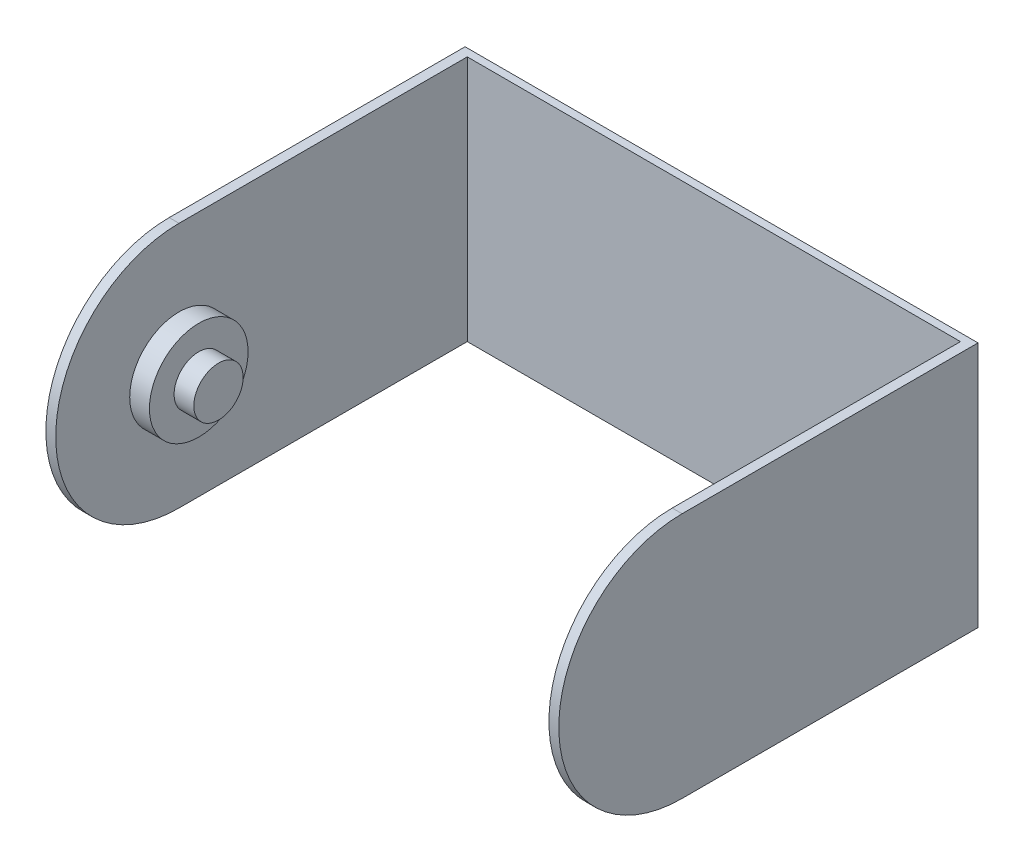
ISO-10303-21;
HEADER;
FILE_DESCRIPTION(('STEP AP214'),'2;1');
FILE_NAME('part.step','',(''),(''),'','','');
FILE_SCHEMA(('AUTOMOTIVE_DESIGN { 1 0 10303 214 1 1 1 1 }'));
ENDSEC;
DATA;
#1=APPLICATION_CONTEXT('core data for automotive mechanical design processes');
#2=APPLICATION_PROTOCOL_DEFINITION('international standard','automotive_design',2000,#1);
#3=PRODUCT_CONTEXT('',#1,'mechanical');
#4=PRODUCT('Part','Part','',(#3));
#5=PRODUCT_RELATED_PRODUCT_CATEGORY('part','',(#4));
#6=PRODUCT_DEFINITION_FORMATION('','',#4);
#7=PRODUCT_DEFINITION_CONTEXT('part definition',#1,'design');
#8=PRODUCT_DEFINITION('design','',#6,#7);
#9=PRODUCT_DEFINITION_SHAPE('','',#8);
#10=(LENGTH_UNIT() NAMED_UNIT(*) SI_UNIT(.MILLI.,.METRE.));
#11=(NAMED_UNIT(*) PLANE_ANGLE_UNIT() SI_UNIT($,.RADIAN.));
#12=(NAMED_UNIT(*) SI_UNIT($,.STERADIAN.) SOLID_ANGLE_UNIT());
#13=UNCERTAINTY_MEASURE_WITH_UNIT(LENGTH_MEASURE(1.E-05),#10,'distance_accuracy_value','');
#14=(GEOMETRIC_REPRESENTATION_CONTEXT(3) GLOBAL_UNCERTAINTY_ASSIGNED_CONTEXT((#13)) GLOBAL_UNIT_ASSIGNED_CONTEXT((#10,
#11,#12)) REPRESENTATION_CONTEXT('',''));
#15=CARTESIAN_POINT('',(0.,0.,0.));
#16=DIRECTION('',(0.,0.,1.));
#17=DIRECTION('',(1.,0.,0.));
#18=AXIS2_PLACEMENT_3D('',#15,#16,#17);
#19=CARTESIAN_POINT('',(-3.23404255319149,25.,-8.05319148936169));
#20=DIRECTION('',(0.,0.,-1.));
#21=DIRECTION('',(-1.,0.,0.));
#22=AXIS2_PLACEMENT_3D('',#19,#20,#21);
#23=PLANE('',#22);
#24=DIRECTION('',(1.,0.,0.));
#25=VECTOR('',#24,1.);
#26=CARTESIAN_POINT('',(-3.23404255319149,0.,-8.05319148936169));
#27=LINE('',#26,#25);
#28=CARTESIAN_POINT('',(-3.23404255319149,0.,-8.05319148936169));
#29=VERTEX_POINT('',#28);
#30=CARTESIAN_POINT('',(48.7659574468085,0.,-8.05319148936169));
#31=VERTEX_POINT('',#30);
#32=EDGE_CURVE('E131',#29,#31,#27,.T.);
#33=ORIENTED_EDGE('',*,*,#32,.F.);
#34=DIRECTION('',(0.,-1.,0.));
#35=VECTOR('',#34,1.);
#36=CARTESIAN_POINT('',(-3.23404255319149,25.,-8.05319148936169));
#37=LINE('',#36,#35);
#38=CARTESIAN_POINT('',(-3.23404255319149,25.,-8.05319148936169));
#39=VERTEX_POINT('',#38);
#40=EDGE_CURVE('E62',#39,#29,#37,.T.);
#41=ORIENTED_EDGE('',*,*,#40,.F.);
#42=DIRECTION('',(1.,0.,0.));
#43=VECTOR('',#42,1.);
#44=CARTESIAN_POINT('',(-3.23404255319149,25.,-8.05319148936169));
#45=LINE('',#44,#43);
#46=CARTESIAN_POINT('',(48.7659574468085,25.,-8.05319148936169));
#47=VERTEX_POINT('',#46);
#48=EDGE_CURVE('E143',#39,#47,#45,.T.);
#49=ORIENTED_EDGE('',*,*,#48,.T.);
#50=DIRECTION('',(0.,-1.,0.));
#51=VECTOR('',#50,1.);
#52=CARTESIAN_POINT('',(48.7659574468085,25.,-8.05319148936169));
#53=LINE('',#52,#51);
#54=EDGE_CURVE('E98',#47,#31,#53,.T.);
#55=ORIENTED_EDGE('',*,*,#54,.T.);
#56=EDGE_LOOP('',(#33,#41,#49,#55));
#57=FACE_BOUND('',#56,.T.);
#58=ADVANCED_FACE('F45',(#57),#23,.T.);
#59=CARTESIAN_POINT('',(-3.23404255319149,25.,21.9468085106383));
#60=DIRECTION('',(-1.,0.,0.));
#61=DIRECTION('',(0.,0.,1.));
#62=AXIS2_PLACEMENT_3D('',#59,#60,#61);
#63=PLANE('',#62);
#64=DIRECTION('',(0.,0.,-1.));
#65=VECTOR('',#64,1.);
#66=CARTESIAN_POINT('',(-3.23404255319149,0.,21.9468085106383));
#67=LINE('',#66,#65);
#68=CARTESIAN_POINT('',(-3.23404255319149,0.,21.9468085106383));
#69=VERTEX_POINT('',#68);
#70=EDGE_CURVE('E146',#69,#29,#67,.T.);
#71=ORIENTED_EDGE('',*,*,#70,.F.);
#72=CARTESIAN_POINT('',(-3.23404255319149,12.5,21.9468085106383));
#73=DIRECTION('',(-1.,0.,0.));
#74=DIRECTION('',(0.,0.,1.));
#75=AXIS2_PLACEMENT_3D('',#72,#73,#74);
#76=CIRCLE('',#75,12.5);
#77=CARTESIAN_POINT('',(-3.23404255319149,25.,21.9468085106383));
#78=VERTEX_POINT('',#77);
#79=EDGE_CURVE('E132',#69,#78,#76,.T.);
#80=ORIENTED_EDGE('',*,*,#79,.T.);
#81=DIRECTION('',(0.,0.,-1.));
#82=VECTOR('',#81,1.);
#83=CARTESIAN_POINT('',(-3.23404255319149,25.,21.9468085106383));
#84=LINE('',#83,#82);
#85=EDGE_CURVE('E115',#78,#39,#84,.T.);
#86=ORIENTED_EDGE('',*,*,#85,.T.);
#87=ORIENTED_EDGE('',*,*,#40,.T.);
#88=EDGE_LOOP('',(#71,#80,#86,#87));
#89=FACE_BOUND('',#88,.T.);
#90=ADVANCED_FACE('F179',(#89),#63,.T.);
#91=CARTESIAN_POINT('',(-2.23404255319149,25.,21.9468085106383));
#92=DIRECTION('',(-1.,0.,0.));
#93=DIRECTION('',(0.,0.,1.));
#94=AXIS2_PLACEMENT_3D('',#91,#92,#93);
#95=PLANE('',#94);
#96=CARTESIAN_POINT('',(-2.23404255319149,12.2219625399964,21.9468085106383));
#97=DIRECTION('',(-1.,0.,0.));
#98=DIRECTION('',(0.,0.,1.));
#99=AXIS2_PLACEMENT_3D('',#96,#97,#98);
#100=CIRCLE('',#99,5.);
#101=CARTESIAN_POINT('',(-2.23404255319149,12.2219625399964,26.9468085106383));
#102=VERTEX_POINT('',#101);
#103=EDGE_CURVE('E48',#102,#102,#100,.F.);
#104=ORIENTED_EDGE('',*,*,#103,.F.);
#105=EDGE_LOOP('',(#104));
#106=FACE_BOUND('',#105,.T.);
#107=DIRECTION('',(0.,0.,-1.));
#108=VECTOR('',#107,1.);
#109=CARTESIAN_POINT('',(-2.23404255319149,0.,21.9468085106383));
#110=LINE('',#109,#108);
#111=CARTESIAN_POINT('',(-2.23404255319149,0.,21.9468085106383));
#112=VERTEX_POINT('',#111);
#113=CARTESIAN_POINT('',(-2.23404255319149,0.,-7.27555893465522));
#114=VERTEX_POINT('',#113);
#115=EDGE_CURVE('E166',#112,#114,#110,.T.);
#116=ORIENTED_EDGE('',*,*,#115,.T.);
#117=DIRECTION('',(0.,-1.,0.));
#118=VECTOR('',#117,1.);
#119=CARTESIAN_POINT('',(-2.23404255319149,25.,-7.27555893465522));
#120=LINE('',#119,#118);
#121=CARTESIAN_POINT('',(-2.23404255319149,25.,-7.27555893465522));
#122=VERTEX_POINT('',#121);
#123=EDGE_CURVE('E126',#122,#114,#120,.T.);
#124=ORIENTED_EDGE('',*,*,#123,.F.);
#125=DIRECTION('',(0.,0.,-1.));
#126=VECTOR('',#125,1.);
#127=CARTESIAN_POINT('',(-2.23404255319149,25.,21.9468085106383));
#128=LINE('',#127,#126);
#129=CARTESIAN_POINT('',(-2.23404255319149,25.,21.9468085106383));
#130=VERTEX_POINT('',#129);
#131=EDGE_CURVE('E113',#130,#122,#128,.T.);
#132=ORIENTED_EDGE('',*,*,#131,.F.);
#133=CARTESIAN_POINT('',(-2.23404255319149,12.5,21.9468085106383));
#134=DIRECTION('',(-1.,0.,0.));
#135=DIRECTION('',(0.,0.,1.));
#136=AXIS2_PLACEMENT_3D('',#133,#134,#135);
#137=CIRCLE('',#136,12.5);
#138=EDGE_CURVE('E124',#112,#130,#137,.T.);
#139=ORIENTED_EDGE('',*,*,#138,.F.);
#140=EDGE_LOOP('',(#116,#124,#132,#139));
#141=FACE_BOUND('',#140,.T.);
#142=ADVANCED_FACE('F123',(#106,#141),#95,.F.);
#143=CARTESIAN_POINT('',(-2.23404255319149,25.,-7.27555893465522));
#144=DIRECTION('',(0.,0.,-1.));
#145=DIRECTION('',(-1.,0.,0.));
#146=AXIS2_PLACEMENT_3D('',#143,#144,#145);
#147=PLANE('',#146);
#148=DIRECTION('',(1.,0.,0.));
#149=VECTOR('',#148,1.);
#150=CARTESIAN_POINT('',(-2.23404255319149,0.,-7.27555893465522));
#151=LINE('',#150,#149);
#152=CARTESIAN_POINT('',(47.7659574468085,0.,-7.27555893465522));
#153=VERTEX_POINT('',#152);
#154=EDGE_CURVE('E164',#114,#153,#151,.T.);
#155=ORIENTED_EDGE('',*,*,#154,.T.);
#156=DIRECTION('',(0.,-1.,0.));
#157=VECTOR('',#156,1.);
#158=CARTESIAN_POINT('',(47.7659574468085,25.,-7.27555893465522));
#159=LINE('',#158,#157);
#160=CARTESIAN_POINT('',(47.7659574468085,25.,-7.27555893465522));
#161=VERTEX_POINT('',#160);
#162=EDGE_CURVE('E172',#161,#153,#159,.T.);
#163=ORIENTED_EDGE('',*,*,#162,.F.);
#164=DIRECTION('',(1.,0.,0.));
#165=VECTOR('',#164,1.);
#166=CARTESIAN_POINT('',(-2.23404255319149,25.,-7.27555893465522));
#167=LINE('',#166,#165);
#168=EDGE_CURVE('E128',#122,#161,#167,.T.);
#169=ORIENTED_EDGE('',*,*,#168,.F.);
#170=ORIENTED_EDGE('',*,*,#123,.T.);
#171=EDGE_LOOP('',(#155,#163,#169,#170));
#172=FACE_BOUND('',#171,.T.);
#173=ADVANCED_FACE('F187',(#172),#147,.F.);
#174=CARTESIAN_POINT('',(47.7659574468085,25.,-7.27555893465522));
#175=DIRECTION('',(1.,0.,0.));
#176=DIRECTION('',(0.,0.,-1.));
#177=AXIS2_PLACEMENT_3D('',#174,#175,#176);
#178=PLANE('',#177);
#179=DIRECTION('',(0.,0.,1.));
#180=VECTOR('',#179,1.);
#181=CARTESIAN_POINT('',(47.7659574468085,0.,-7.27555893465522));
#182=LINE('',#181,#180);
#183=CARTESIAN_POINT('',(47.7659574468085,0.,21.9468085106383));
#184=VERTEX_POINT('',#183);
#185=EDGE_CURVE('E161',#153,#184,#182,.T.);
#186=ORIENTED_EDGE('',*,*,#185,.T.);
#187=CARTESIAN_POINT('',(47.7659574468085,12.5,21.9468085106383));
#188=DIRECTION('',(1.,0.,0.));
#189=DIRECTION('',(0.,0.,-1.));
#190=AXIS2_PLACEMENT_3D('',#187,#188,#189);
#191=CIRCLE('',#190,12.5);
#192=CARTESIAN_POINT('',(47.7659574468085,25.,21.9468085106383));
#193=VERTEX_POINT('',#192);
#194=EDGE_CURVE('E137',#193,#184,#191,.T.);
#195=ORIENTED_EDGE('',*,*,#194,.F.);
#196=DIRECTION('',(0.,0.,1.));
#197=VECTOR('',#196,1.);
#198=CARTESIAN_POINT('',(47.7659574468085,25.,-7.27555893465522));
#199=LINE('',#198,#197);
#200=EDGE_CURVE('E151',#161,#193,#199,.T.);
#201=ORIENTED_EDGE('',*,*,#200,.F.);
#202=ORIENTED_EDGE('',*,*,#162,.T.);
#203=EDGE_LOOP('',(#186,#195,#201,#202));
#204=FACE_BOUND('',#203,.T.);
#205=ADVANCED_FACE('F195',(#204),#178,.F.);
#206=CARTESIAN_POINT('',(48.7659574468085,25.,-8.05319148936169));
#207=DIRECTION('',(1.,0.,0.));
#208=DIRECTION('',(0.,0.,-1.));
#209=AXIS2_PLACEMENT_3D('',#206,#207,#208);
#210=PLANE('',#209);
#211=DIRECTION('',(0.,0.,1.));
#212=VECTOR('',#211,1.);
#213=CARTESIAN_POINT('',(48.7659574468085,0.,-8.05319148936169));
#214=LINE('',#213,#212);
#215=CARTESIAN_POINT('',(48.7659574468085,0.,21.9468085106383));
#216=VERTEX_POINT('',#215);
#217=EDGE_CURVE('E135',#31,#216,#214,.T.);
#218=ORIENTED_EDGE('',*,*,#217,.F.);
#219=ORIENTED_EDGE('',*,*,#54,.F.);
#220=DIRECTION('',(0.,0.,1.));
#221=VECTOR('',#220,1.);
#222=CARTESIAN_POINT('',(48.7659574468085,25.,-8.05319148936169));
#223=LINE('',#222,#221);
#224=CARTESIAN_POINT('',(48.7659574468085,25.,21.9468085106383));
#225=VERTEX_POINT('',#224);
#226=EDGE_CURVE('E145',#47,#225,#223,.T.);
#227=ORIENTED_EDGE('',*,*,#226,.T.);
#228=CARTESIAN_POINT('',(48.7659574468085,12.5,21.9468085106383));
#229=DIRECTION('',(1.,0.,0.));
#230=DIRECTION('',(0.,0.,-1.));
#231=AXIS2_PLACEMENT_3D('',#228,#229,#230);
#232=CIRCLE('',#231,12.5);
#233=EDGE_CURVE('E140',#225,#216,#232,.T.);
#234=ORIENTED_EDGE('',*,*,#233,.T.);
#235=EDGE_LOOP('',(#218,#219,#227,#234));
#236=FACE_BOUND('',#235,.T.);
#237=ADVANCED_FACE('F175',(#236),#210,.T.);
#238=CARTESIAN_POINT('',(0.,25.,0.));
#239=DIRECTION('',(0.,-1.,0.));
#240=DIRECTION('',(0.,0.,-1.));
#241=AXIS2_PLACEMENT_3D('',#238,#239,#240);
#242=PLANE('',#241);
#243=ORIENTED_EDGE('',*,*,#48,.F.);
#244=ORIENTED_EDGE('',*,*,#85,.F.);
#245=DIRECTION('',(1.,0.,0.));
#246=VECTOR('',#245,1.);
#247=CARTESIAN_POINT('',(-3.23404255319149,25.,21.9468085106383));
#248=LINE('',#247,#246);
#249=EDGE_CURVE('E110',#78,#130,#248,.T.);
#250=ORIENTED_EDGE('',*,*,#249,.T.);
#251=ORIENTED_EDGE('',*,*,#131,.T.);
#252=ORIENTED_EDGE('',*,*,#168,.T.);
#253=ORIENTED_EDGE('',*,*,#200,.T.);
#254=DIRECTION('',(-1.,0.,0.));
#255=VECTOR('',#254,1.);
#256=CARTESIAN_POINT('',(48.7659574468085,25.,21.9468085106383));
#257=LINE('',#256,#255);
#258=EDGE_CURVE('E148',#225,#193,#257,.T.);
#259=ORIENTED_EDGE('',*,*,#258,.F.);
#260=ORIENTED_EDGE('',*,*,#226,.F.);
#261=EDGE_LOOP('',(#243,#244,#250,#251,#252,#253,#259,#260));
#262=FACE_BOUND('',#261,.T.);
#263=ADVANCED_FACE('F112',(#262),#242,.F.);
#264=CARTESIAN_POINT('',(0.,0.,0.));
#265=DIRECTION('',(0.,-1.,0.));
#266=DIRECTION('',(0.,0.,-1.));
#267=AXIS2_PLACEMENT_3D('',#264,#265,#266);
#268=PLANE('',#267);
#269=ORIENTED_EDGE('',*,*,#32,.T.);
#270=ORIENTED_EDGE('',*,*,#217,.T.);
#271=DIRECTION('',(-1.,0.,0.));
#272=VECTOR('',#271,1.);
#273=CARTESIAN_POINT('',(48.7659574468085,0.,21.9468085106383));
#274=LINE('',#273,#272);
#275=EDGE_CURVE('E158',#216,#184,#274,.T.);
#276=ORIENTED_EDGE('',*,*,#275,.T.);
#277=ORIENTED_EDGE('',*,*,#185,.F.);
#278=ORIENTED_EDGE('',*,*,#154,.F.);
#279=ORIENTED_EDGE('',*,*,#115,.F.);
#280=DIRECTION('',(1.,0.,0.));
#281=VECTOR('',#280,1.);
#282=CARTESIAN_POINT('',(-3.23404255319149,0.,21.9468085106383));
#283=LINE('',#282,#281);
#284=EDGE_CURVE('E87',#69,#112,#283,.T.);
#285=ORIENTED_EDGE('',*,*,#284,.F.);
#286=ORIENTED_EDGE('',*,*,#70,.T.);
#287=EDGE_LOOP('',(#269,#270,#276,#277,#278,#279,#285,#286));
#288=FACE_BOUND('',#287,.T.);
#289=ADVANCED_FACE('F178',(#288),#268,.T.);
#290=CARTESIAN_POINT('',(-2.23404255319149,12.5,21.9468085106383));
#291=DIRECTION('',(-1.,0.,0.));
#292=DIRECTION('',(0.,0.,1.));
#293=AXIS2_PLACEMENT_3D('',#290,#291,#292);
#294=CYLINDRICAL_SURFACE('',#293,12.5);
#295=ORIENTED_EDGE('',*,*,#79,.F.);
#296=ORIENTED_EDGE('',*,*,#284,.T.);
#297=ORIENTED_EDGE('',*,*,#138,.T.);
#298=ORIENTED_EDGE('',*,*,#249,.F.);
#299=EDGE_LOOP('',(#295,#296,#297,#298));
#300=FACE_BOUND('',#299,.T.);
#301=ADVANCED_FACE('F130',(#300),#294,.T.);
#302=CARTESIAN_POINT('',(47.7659574468085,12.5,21.9468085106383));
#303=DIRECTION('',(1.,0.,0.));
#304=DIRECTION('',(0.,0.,-1.));
#305=AXIS2_PLACEMENT_3D('',#302,#303,#304);
#306=CYLINDRICAL_SURFACE('',#305,12.5);
#307=ORIENTED_EDGE('',*,*,#233,.F.);
#308=ORIENTED_EDGE('',*,*,#258,.T.);
#309=ORIENTED_EDGE('',*,*,#194,.T.);
#310=ORIENTED_EDGE('',*,*,#275,.F.);
#311=EDGE_LOOP('',(#307,#308,#309,#310));
#312=FACE_BOUND('',#311,.T.);
#313=ADVANCED_FACE('F208',(#312),#306,.T.);
#314=CARTESIAN_POINT('',(-0.234042553191487,12.2219625399964,21.9468085106383));
#315=DIRECTION('',(-1.,0.,0.));
#316=DIRECTION('',(0.,0.,1.));
#317=AXIS2_PLACEMENT_3D('',#314,#315,#316);
#318=CYLINDRICAL_SURFACE('',#317,5.);
#319=CARTESIAN_POINT('',(-0.234042553191487,12.2219625399964,21.9468085106383));
#320=DIRECTION('',(1.,0.,0.));
#321=DIRECTION('',(0.,0.,-1.));
#322=AXIS2_PLACEMENT_3D('',#319,#320,#321);
#323=CIRCLE('',#322,5.);
#324=CARTESIAN_POINT('',(-0.234042553191487,12.2219625399964,16.9468085106383));
#325=VERTEX_POINT('',#324);
#326=EDGE_CURVE('E232',#325,#325,#323,.T.);
#327=ORIENTED_EDGE('',*,*,#326,.F.);
#328=EDGE_LOOP('',(#327));
#329=FACE_BOUND('',#328,.T.);
#330=ORIENTED_EDGE('',*,*,#103,.T.);
#331=EDGE_LOOP('',(#330));
#332=FACE_BOUND('',#331,.T.);
#333=ADVANCED_FACE('F211',(#329,#332),#318,.T.);
#334=CARTESIAN_POINT('',(-0.234042553191487,12.2219625399964,21.9468085106383));
#335=DIRECTION('',(1.,0.,0.));
#336=DIRECTION('',(0.,0.,-1.));
#337=AXIS2_PLACEMENT_3D('',#334,#335,#336);
#338=PLANE('',#337);
#339=CARTESIAN_POINT('',(-0.234042553191487,12.2219625399964,21.9468085106383));
#340=DIRECTION('',(1.,0.,0.));
#341=DIRECTION('',(0.,0.,-1.));
#342=AXIS2_PLACEMENT_3D('',#339,#340,#341);
#343=CIRCLE('',#342,2.5);
#344=CARTESIAN_POINT('',(-0.234042553191487,12.2219625399964,19.4468085106383));
#345=VERTEX_POINT('',#344);
#346=EDGE_CURVE('E11',#345,#345,#343,.T.);
#347=ORIENTED_EDGE('',*,*,#346,.F.);
#348=EDGE_LOOP('',(#347));
#349=FACE_BOUND('',#348,.T.);
#350=ORIENTED_EDGE('',*,*,#326,.T.);
#351=EDGE_LOOP('',(#350));
#352=FACE_BOUND('',#351,.T.);
#353=ADVANCED_FACE('F215',(#349,#352),#338,.T.);
#354=CARTESIAN_POINT('',(1.76595744680851,12.2219625399964,21.9468085106383));
#355=DIRECTION('',(-1.,0.,0.));
#356=DIRECTION('',(0.,0.,1.));
#357=AXIS2_PLACEMENT_3D('',#354,#355,#356);
#358=CYLINDRICAL_SURFACE('',#357,2.5);
#359=CARTESIAN_POINT('',(1.76595744680851,12.2219625399964,21.9468085106383));
#360=DIRECTION('',(1.,0.,0.));
#361=DIRECTION('',(0.,0.,-1.));
#362=AXIS2_PLACEMENT_3D('',#359,#360,#361);
#363=CIRCLE('',#362,2.5);
#364=CARTESIAN_POINT('',(1.76595744680851,12.2219625399964,19.4468085106383));
#365=VERTEX_POINT('',#364);
#366=EDGE_CURVE('E231',#365,#365,#363,.T.);
#367=ORIENTED_EDGE('',*,*,#366,.F.);
#368=EDGE_LOOP('',(#367));
#369=FACE_BOUND('',#368,.T.);
#370=ORIENTED_EDGE('',*,*,#346,.T.);
#371=EDGE_LOOP('',(#370));
#372=FACE_BOUND('',#371,.T.);
#373=ADVANCED_FACE('F219',(#369,#372),#358,.T.);
#374=CARTESIAN_POINT('',(1.76595744680851,12.2219625399964,21.9468085106383));
#375=DIRECTION('',(1.,0.,0.));
#376=DIRECTION('',(0.,0.,-1.));
#377=AXIS2_PLACEMENT_3D('',#374,#375,#376);
#378=PLANE('',#377);
#379=ORIENTED_EDGE('',*,*,#366,.T.);
#380=EDGE_LOOP('',(#379));
#381=FACE_BOUND('',#380,.T.);
#382=ADVANCED_FACE('F223',(#381),#378,.T.);
#383=CLOSED_SHELL('',(#58,#90,#142,#173,#205,#237,#263,#289,#301,#313,#333,#353,#373,#382));
#384=MANIFOLD_SOLID_BREP('B2',#383);
#385=ADVANCED_BREP_SHAPE_REPRESENTATION('',(#18,#384),#14);
#386=SHAPE_DEFINITION_REPRESENTATION(#9,#385);
ENDSEC;
END-ISO-10303-21;
